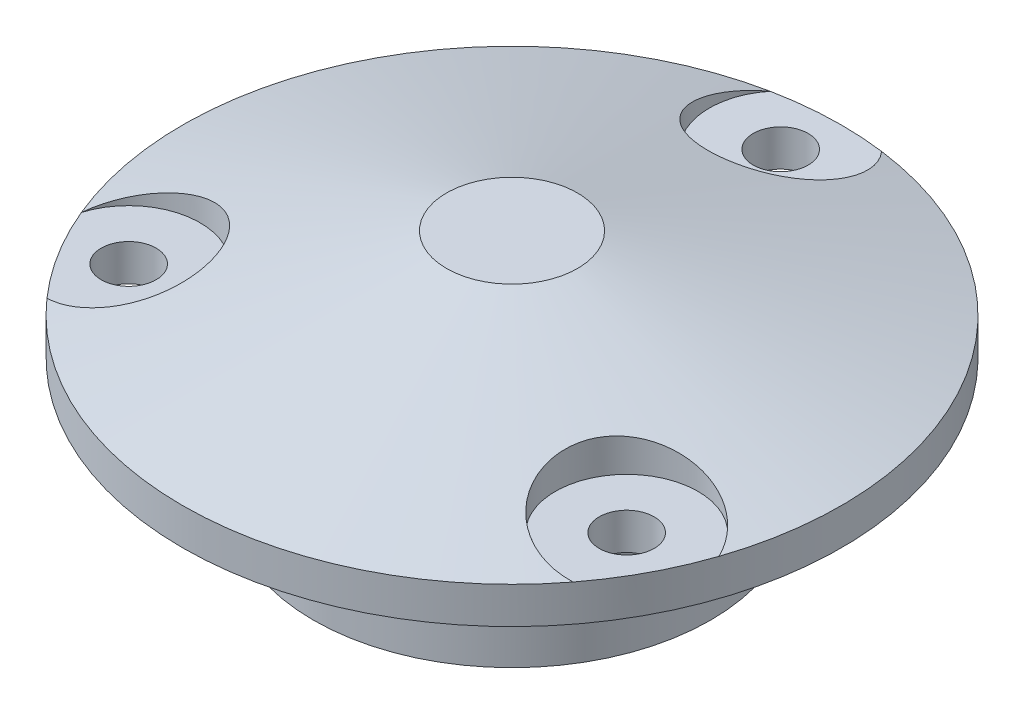
ISO-10303-21;
HEADER;
FILE_DESCRIPTION(('STEP AP214'),'2;1');
FILE_NAME('part.step','',(''),(''),'','','');
FILE_SCHEMA(('AUTOMOTIVE_DESIGN { 1 0 10303 214 1 1 1 1 }'));
ENDSEC;
DATA;
#1=APPLICATION_CONTEXT('core data for automotive mechanical design processes');
#2=APPLICATION_PROTOCOL_DEFINITION('international standard','automotive_design',2000,#1);
#3=PRODUCT_CONTEXT('',#1,'mechanical');
#4=PRODUCT('Part','Part','',(#3));
#5=PRODUCT_RELATED_PRODUCT_CATEGORY('part','',(#4));
#6=PRODUCT_DEFINITION_FORMATION('','',#4);
#7=PRODUCT_DEFINITION_CONTEXT('part definition',#1,'design');
#8=PRODUCT_DEFINITION('design','',#6,#7);
#9=PRODUCT_DEFINITION_SHAPE('','',#8);
#10=(LENGTH_UNIT() NAMED_UNIT(*) SI_UNIT(.MILLI.,.METRE.));
#11=(NAMED_UNIT(*) PLANE_ANGLE_UNIT() SI_UNIT($,.RADIAN.));
#12=(NAMED_UNIT(*) SI_UNIT($,.STERADIAN.) SOLID_ANGLE_UNIT());
#13=UNCERTAINTY_MEASURE_WITH_UNIT(LENGTH_MEASURE(1.E-05),#10,'distance_accuracy_value','');
#14=(GEOMETRIC_REPRESENTATION_CONTEXT(3) GLOBAL_UNCERTAINTY_ASSIGNED_CONTEXT((#13)) GLOBAL_UNIT_ASSIGNED_CONTEXT((#10,
#11,#12)) REPRESENTATION_CONTEXT('',''));
#15=CARTESIAN_POINT('',(0.,0.,0.));
#16=DIRECTION('',(0.,0.,1.));
#17=DIRECTION('',(1.,0.,0.));
#18=AXIS2_PLACEMENT_3D('',#15,#16,#17);
#19=CARTESIAN_POINT('',(-0.514611842093936,11.,-15.1912861421265));
#20=DIRECTION('',(0.,-1.,0.));
#21=DIRECTION('',(0.,0.,-1.));
#22=AXIS2_PLACEMENT_3D('',#19,#20,#21);
#23=CYLINDRICAL_SURFACE('',#22,1.50000000000036);
#24=CARTESIAN_POINT('',(-0.514611842093936,7.,-15.1912861421265));
#25=DIRECTION('',(0.,-1.,0.));
#26=DIRECTION('',(0.,0.,-1.));
#27=AXIS2_PLACEMENT_3D('',#24,#25,#26);
#28=CIRCLE('',#27,1.50000000000036);
#29=CARTESIAN_POINT('',(-0.514611842093936,7.,-16.6912861421269));
#30=VERTEX_POINT('',#29);
#31=EDGE_CURVE('E117',#30,#30,#28,.T.);
#32=ORIENTED_EDGE('',*,*,#31,.T.);
#33=EDGE_LOOP('',(#32));
#34=FACE_BOUND('',#33,.T.);
#35=CARTESIAN_POINT('',(-0.514611842093936,9.,-15.1912861421265));
#36=DIRECTION('',(0.,1.,0.));
#37=DIRECTION('',(0.,0.,1.));
#38=AXIS2_PLACEMENT_3D('',#35,#36,#37);
#39=CIRCLE('',#38,1.50000000000036);
#40=CARTESIAN_POINT('',(-0.514611842093936,9.,-13.6912861421262));
#41=VERTEX_POINT('',#40);
#42=EDGE_CURVE('E118',#41,#41,#39,.F.);
#43=ORIENTED_EDGE('',*,*,#42,.F.);
#44=EDGE_LOOP('',(#43));
#45=FACE_BOUND('',#44,.T.);
#46=ADVANCED_FACE('F33',(#34,#45),#23,.F.);
#47=CARTESIAN_POINT('',(13.4133456362877,11.,7.14997614272195));
#48=DIRECTION('',(0.,-1.,0.));
#49=DIRECTION('',(0.,0.,-1.));
#50=AXIS2_PLACEMENT_3D('',#47,#48,#49);
#51=CYLINDRICAL_SURFACE('',#50,1.50000000000077);
#52=CARTESIAN_POINT('',(13.4133456362877,7.,7.14997614272195));
#53=DIRECTION('',(0.,-1.,0.));
#54=DIRECTION('',(0.,0.,-1.));
#55=AXIS2_PLACEMENT_3D('',#52,#53,#54);
#56=CIRCLE('',#55,1.50000000000077);
#57=CARTESIAN_POINT('',(13.4133456362877,7.,5.64997614272117));
#58=VERTEX_POINT('',#57);
#59=EDGE_CURVE('E121',#58,#58,#56,.T.);
#60=ORIENTED_EDGE('',*,*,#59,.T.);
#61=EDGE_LOOP('',(#60));
#62=FACE_BOUND('',#61,.T.);
#63=CARTESIAN_POINT('',(13.4133456362877,9.,7.14997614272195));
#64=DIRECTION('',(0.,1.,0.));
#65=DIRECTION('',(0.,0.,1.));
#66=AXIS2_PLACEMENT_3D('',#63,#64,#65);
#67=CIRCLE('',#66,1.50000000000077);
#68=CARTESIAN_POINT('',(13.4133456362877,9.,8.64997614272272));
#69=VERTEX_POINT('',#68);
#70=EDGE_CURVE('E78',#69,#69,#67,.F.);
#71=ORIENTED_EDGE('',*,*,#70,.F.);
#72=EDGE_LOOP('',(#71));
#73=FACE_BOUND('',#72,.T.);
#74=ADVANCED_FACE('F147',(#62,#73),#51,.F.);
#75=CARTESIAN_POINT('',(-12.8987337941931,11.,8.04130999940566));
#76=DIRECTION('',(0.,-1.,0.));
#77=DIRECTION('',(0.,0.,-1.));
#78=AXIS2_PLACEMENT_3D('',#75,#76,#77);
#79=CYLINDRICAL_SURFACE('',#78,1.5);
#80=CARTESIAN_POINT('',(-12.8987337941931,7.,8.04130999940566));
#81=DIRECTION('',(0.,-1.,0.));
#82=DIRECTION('',(0.,0.,-1.));
#83=AXIS2_PLACEMENT_3D('',#80,#81,#82);
#84=CIRCLE('',#83,1.5);
#85=CARTESIAN_POINT('',(-12.8987337941931,7.,6.54130999940567));
#86=VERTEX_POINT('',#85);
#87=EDGE_CURVE('E126',#86,#86,#84,.T.);
#88=ORIENTED_EDGE('',*,*,#87,.T.);
#89=EDGE_LOOP('',(#88));
#90=FACE_BOUND('',#89,.T.);
#91=CARTESIAN_POINT('',(-12.8987337941931,9.,8.04130999940566));
#92=DIRECTION('',(0.,1.,0.));
#93=DIRECTION('',(0.,0.,1.));
#94=AXIS2_PLACEMENT_3D('',#91,#92,#93);
#95=CIRCLE('',#94,1.5);
#96=CARTESIAN_POINT('',(-12.8987337941931,9.,9.54130999940566));
#97=VERTEX_POINT('',#96);
#98=EDGE_CURVE('E79',#97,#97,#95,.F.);
#99=ORIENTED_EDGE('',*,*,#98,.F.);
#100=EDGE_LOOP('',(#99));
#101=FACE_BOUND('',#100,.T.);
#102=ADVANCED_FACE('F153',(#90,#101),#79,.F.);
#103=CARTESIAN_POINT('',(0.,0.,0.));
#104=DIRECTION('',(0.,1.,0.));
#105=DIRECTION('',(0.,0.,1.));
#106=AXIS2_PLACEMENT_3D('',#103,#104,#105);
#107=PLANE('',#106);
#108=CARTESIAN_POINT('',(0.,0.,0.));
#109=DIRECTION('',(0.,1.,0.));
#110=DIRECTION('',(0.,0.,1.));
#111=AXIS2_PLACEMENT_3D('',#108,#109,#110);
#112=CIRCLE('',#111,10.85);
#113=CARTESIAN_POINT('',(0.,0.,10.85));
#114=VERTEX_POINT('',#113);
#115=EDGE_CURVE('E293',#114,#114,#112,.T.);
#116=ORIENTED_EDGE('',*,*,#115,.F.);
#117=EDGE_LOOP('',(#116));
#118=FACE_BOUND('',#117,.T.);
#119=CARTESIAN_POINT('',(0.,0.,0.));
#120=DIRECTION('',(0.,1.,0.));
#121=DIRECTION('',(0.,0.,1.));
#122=AXIS2_PLACEMENT_3D('',#119,#120,#121);
#123=CIRCLE('',#122,9.);
#124=CARTESIAN_POINT('',(0.,0.,9.));
#125=VERTEX_POINT('',#124);
#126=EDGE_CURVE('E112',#125,#125,#123,.T.);
#127=ORIENTED_EDGE('',*,*,#126,.T.);
#128=EDGE_LOOP('',(#127));
#129=FACE_BOUND('',#128,.T.);
#130=ADVANCED_FACE('F160',(#118,#129),#107,.F.);
#131=CARTESIAN_POINT('',(0.,7.,0.));
#132=DIRECTION('',(0.,-1.,0.));
#133=DIRECTION('',(0.,0.,-1.));
#134=AXIS2_PLACEMENT_3D('',#131,#132,#133);
#135=CYLINDRICAL_SURFACE('',#134,10.85);
#136=CARTESIAN_POINT('',(0.,7.,0.));
#137=DIRECTION('',(0.,1.,0.));
#138=DIRECTION('',(0.,0.,1.));
#139=AXIS2_PLACEMENT_3D('',#136,#137,#138);
#140=CIRCLE('',#139,10.85);
#141=CARTESIAN_POINT('',(0.,7.,10.85));
#142=VERTEX_POINT('',#141);
#143=EDGE_CURVE('E95',#142,#142,#140,.T.);
#144=ORIENTED_EDGE('',*,*,#143,.F.);
#145=EDGE_LOOP('',(#144));
#146=FACE_BOUND('',#145,.T.);
#147=ORIENTED_EDGE('',*,*,#115,.T.);
#148=EDGE_LOOP('',(#147));
#149=FACE_BOUND('',#148,.T.);
#150=ADVANCED_FACE('F35',(#146,#149),#135,.T.);
#151=CARTESIAN_POINT('',(0.,7.,0.));
#152=DIRECTION('',(0.,-1.,0.));
#153=DIRECTION('',(0.,0.,-1.));
#154=AXIS2_PLACEMENT_3D('',#151,#152,#153);
#155=CYLINDRICAL_SURFACE('',#154,9.);
#156=CARTESIAN_POINT('',(0.,7.,0.));
#157=DIRECTION('',(0.,1.,0.));
#158=DIRECTION('',(0.,0.,1.));
#159=AXIS2_PLACEMENT_3D('',#156,#157,#158);
#160=CIRCLE('',#159,9.);
#161=CARTESIAN_POINT('',(0.,7.,9.));
#162=VERTEX_POINT('',#161);
#163=EDGE_CURVE('E108',#162,#162,#160,.T.);
#164=ORIENTED_EDGE('',*,*,#163,.T.);
#165=EDGE_LOOP('',(#164));
#166=FACE_BOUND('',#165,.T.);
#167=ORIENTED_EDGE('',*,*,#126,.F.);
#168=EDGE_LOOP('',(#167));
#169=FACE_BOUND('',#168,.T.);
#170=ADVANCED_FACE('F264',(#166,#169),#155,.F.);
#171=CARTESIAN_POINT('',(0.,7.,0.));
#172=DIRECTION('',(0.,1.,0.));
#173=DIRECTION('',(0.,0.,1.));
#174=AXIS2_PLACEMENT_3D('',#171,#172,#173);
#175=PLANE('',#174);
#176=ORIENTED_EDGE('',*,*,#163,.F.);
#177=EDGE_LOOP('',(#176));
#178=FACE_BOUND('',#177,.T.);
#179=ADVANCED_FACE('F144',(#178),#175,.F.);
#180=CARTESIAN_POINT('',(0.,9.,0.));
#181=DIRECTION('',(0.,-1.,0.));
#182=DIRECTION('',(0.,0.,-1.));
#183=AXIS2_PLACEMENT_3D('',#180,#181,#182);
#184=CYLINDRICAL_SURFACE('',#183,18.);
#185=CARTESIAN_POINT('',(0.,9.,0.));
#186=DIRECTION('',(0.,1.,0.));
#187=DIRECTION('',(0.,0.,1.));
#188=AXIS2_PLACEMENT_3D('',#185,#186,#187);
#189=CIRCLE('',#188,18.);
#190=CARTESIAN_POINT('',(14.285312354494,9.,10.9512488299071));
#191=VERTEX_POINT('',#190);
#192=CARTESIAN_POINT('',(17.0552623288384,9.,5.75482640003215));
#193=VERTEX_POINT('',#192);
#194=EDGE_CURVE('E100',#191,#193,#189,.T.);
#195=ORIENTED_EDGE('',*,*,#194,.F.);
#196=CARTESIAN_POINT('',(-13.5114570212166,9.,11.8928772449654));
#197=VERTEX_POINT('',#196);
#198=EDGE_CURVE('E92',#197,#191,#189,.T.);
#199=ORIENTED_EDGE('',*,*,#198,.F.);
#200=CARTESIAN_POINT('',(0.,9.,0.));
#201=DIRECTION('',(0.,1.,0.));
#202=DIRECTION('',(0.,0.,1.));
#203=AXIS2_PLACEMENT_3D('',#200,#201,#202);
#204=CIRCLE('',#203,18.);
#205=CARTESIAN_POINT('',(-16.626715867111,9.,6.89581898503428));
#206=VERTEX_POINT('',#205);
#207=EDGE_CURVE('E72',#206,#197,#204,.T.);
#208=ORIENTED_EDGE('',*,*,#207,.F.);
#209=CARTESIAN_POINT('',(-3.54380530761995,9.,-17.6477036449983));
#210=VERTEX_POINT('',#209);
#211=EDGE_CURVE('E94',#210,#206,#189,.T.);
#212=ORIENTED_EDGE('',*,*,#211,.F.);
#213=CARTESIAN_POINT('',(0.,9.,0.));
#214=DIRECTION('',(0.,1.,0.));
#215=DIRECTION('',(0.,0.,1.));
#216=AXIS2_PLACEMENT_3D('',#213,#214,#215);
#217=CIRCLE('',#216,18.);
#218=CARTESIAN_POINT('',(2.34140351261658,9.,-17.8470678149411));
#219=VERTEX_POINT('',#218);
#220=EDGE_CURVE('E116',#219,#210,#217,.T.);
#221=ORIENTED_EDGE('',*,*,#220,.F.);
#222=EDGE_CURVE('E103',#193,#219,#189,.T.);
#223=ORIENTED_EDGE('',*,*,#222,.F.);
#224=EDGE_LOOP('',(#195,#199,#208,#212,#221,#223));
#225=FACE_BOUND('',#224,.T.);
#226=CARTESIAN_POINT('',(0.,7.,0.));
#227=DIRECTION('',(0.,1.,0.));
#228=DIRECTION('',(0.,0.,1.));
#229=AXIS2_PLACEMENT_3D('',#226,#227,#228);
#230=CIRCLE('',#229,18.);
#231=CARTESIAN_POINT('',(0.,7.,18.));
#232=VERTEX_POINT('',#231);
#233=EDGE_CURVE('E101',#232,#232,#230,.T.);
#234=ORIENTED_EDGE('',*,*,#233,.T.);
#235=EDGE_LOOP('',(#234));
#236=FACE_BOUND('',#235,.T.);
#237=ADVANCED_FACE('F97',(#225,#236),#184,.T.);
#238=ORIENTED_EDGE('',*,*,#87,.F.);
#239=EDGE_LOOP('',(#238));
#240=FACE_BOUND('',#239,.T.);
#241=ORIENTED_EDGE('',*,*,#59,.F.);
#242=EDGE_LOOP('',(#241));
#243=FACE_BOUND('',#242,.T.);
#244=ORIENTED_EDGE('',*,*,#31,.F.);
#245=EDGE_LOOP('',(#244));
#246=FACE_BOUND('',#245,.T.);
#247=ORIENTED_EDGE('',*,*,#143,.T.);
#248=EDGE_LOOP('',(#247));
#249=FACE_BOUND('',#248,.T.);
#250=ORIENTED_EDGE('',*,*,#233,.F.);
#251=EDGE_LOOP('',(#250));
#252=FACE_BOUND('',#251,.T.);
#253=ADVANCED_FACE('F136',(#240,#243,#246,#249,#252),#175,.F.);
#254=CARTESIAN_POINT('',(0.,9.,0.));
#255=DIRECTION('',(0.,-1.,0.));
#256=DIRECTION('',(0.,0.,1.));
#257=AXIS2_PLACEMENT_3D('',#254,#255,#256);
#258=CONICAL_SURFACE('',#257,18.,1.30027029273578);
#259=CARTESIAN_POINT('',(0.,13.,0.));
#260=DIRECTION('',(0.,1.,0.));
#261=DIRECTION('',(0.,0.,1.));
#262=AXIS2_PLACEMENT_3D('',#259,#260,#261);
#263=CIRCLE('',#262,3.57646596495634);
#264=CARTESIAN_POINT('',(0.,13.,3.57646596495634));
#265=VERTEX_POINT('',#264);
#266=EDGE_CURVE('E105',#265,#265,#263,.T.);
#267=ORIENTED_EDGE('',*,*,#266,.F.);
#268=EDGE_LOOP('',(#267));
#269=FACE_BOUND('',#268,.T.);
#270=ORIENTED_EDGE('',*,*,#222,.T.);
#271=CARTESIAN_POINT('',(2.34063294063594,8.9998,-17.8478962434952));
#272=CARTESIAN_POINT('',(2.41697476906014,9.01960432029536,-17.7658628833271));
#273=CARTESIAN_POINT('',(2.48965575463602,9.04024400706451,-17.6806409991363));
#274=CARTESIAN_POINT('',(2.62725546708487,9.08308142590544,-17.5045374242219));
#275=CARTESIAN_POINT('',(2.69217566167115,9.10527886211294,-17.4136568086323));
#276=CARTESIAN_POINT('',(2.81374004086759,9.15108808098175,-17.2270786040962));
#277=CARTESIAN_POINT('',(2.87039797547931,9.17469741943295,-17.1313893829437));
#278=CARTESIAN_POINT('',(2.97522064539394,9.22323634310521,-16.9358190137901));
#279=CARTESIAN_POINT('',(3.02338516399314,9.24816596199123,-16.8359377589126));
#280=CARTESIAN_POINT('',(3.15466441875566,9.32474339099612,-16.5311477500894));
#281=CARTESIAN_POINT('',(3.22470008334957,9.37823072470449,-16.3208841567296));
#282=CARTESIAN_POINT('',(3.32814786567089,9.48890662177049,-15.8925867533273));
#283=CARTESIAN_POINT('',(3.36155375871864,9.54609581245498,-15.6745516291278));
#284=CARTESIAN_POINT('',(3.39158566074824,9.66414723598745,-15.2322743948386));
#285=CARTESIAN_POINT('',(3.38747147947888,9.72505973213838,-15.0079947919914));
#286=CARTESIAN_POINT('',(3.34104471109292,9.84805167470234,-14.5637309926598));
#287=CARTESIAN_POINT('',(3.2987248321539,9.91013134166326,-14.34374762433));
#288=CARTESIAN_POINT('',(3.17605514299334,10.034856850505,-13.9104583683503));
#289=CARTESIAN_POINT('',(3.0950738447657,10.0974944937482,-13.6973284948538));
#290=CARTESIAN_POINT('',(2.89691587880258,10.2202765492199,-13.2878091273023));
#291=CARTESIAN_POINT('',(2.77973851796399,10.2804209136806,-13.0914199538999));
#292=CARTESIAN_POINT('',(2.51256180464274,10.3956982364815,-12.7218706625308));
#293=CARTESIAN_POINT('',(2.36268550710104,10.450848914924,-12.5486272795421));
#294=CARTESIAN_POINT('',(2.03358311923908,10.553791385868,-12.2300148484713));
#295=CARTESIAN_POINT('',(1.85436105413633,10.6015841858722,-12.0846419834531));
#296=CARTESIAN_POINT('',(1.47790999672663,10.6855538346794,-11.831290895437));
#297=CARTESIAN_POINT('',(1.28150172065491,10.7220707373655,-11.7222081218028));
#298=CARTESIAN_POINT('',(0.871316728822382,10.7831554985811,-11.5389452090264));
#299=CARTESIAN_POINT('',(0.657547876043658,10.8077287318194,-11.4647493710857));
#300=CARTESIAN_POINT('',(0.231612252084536,10.8420112878336,-11.3574021998377));
#301=CARTESIAN_POINT('',(0.0200259473185642,10.8524758215883,-11.3221853398477));
#302=CARTESIAN_POINT('',(-0.406274524458361,10.8602293658847,-11.2869332057943));
#303=CARTESIAN_POINT('',(-0.620987897200793,10.8575216659012,-11.286889148553));
#304=CARTESIAN_POINT('',(-1.03911117693649,10.8394945190928,-11.3212342471588));
#305=CARTESIAN_POINT('',(-1.24264698321864,10.8246408284035,-11.3543617575371));
#306=CARTESIAN_POINT('',(-1.64093359985215,10.7839675355721,-11.4518419709362));
#307=CARTESIAN_POINT('',(-1.83568376351764,10.7581471276538,-11.5161969684371));
#308=CARTESIAN_POINT('',(-2.21470569454323,10.696631483714,-11.6752300699824));
#309=CARTESIAN_POINT('',(-2.39873939421595,10.6607739219942,-11.7704110597852));
#310=CARTESIAN_POINT('',(-2.74830417935775,10.5813579813276,-11.9876945010701));
#311=CARTESIAN_POINT('',(-2.91383111916674,10.5377978825708,-12.1098029663828));
#312=CARTESIAN_POINT('',(-3.23091594571764,10.4425239148044,-12.3845153755062));
#313=CARTESIAN_POINT('',(-3.38128734275724,10.3905023921978,-12.5383820098028));
#314=CARTESIAN_POINT('',(-3.65421751230065,10.2822635976626,-12.8677873060413));
#315=CARTESIAN_POINT('',(-3.7767697519062,10.2260453443071,-13.0433310436026));
#316=CARTESIAN_POINT('',(-3.99640486159216,10.1086150917399,-13.4201561991823));
#317=CARTESIAN_POINT('',(-4.09201659635385,10.0472925994391,-13.6222603486567));
#318=CARTESIAN_POINT('',(-4.24737930959957,9.92400013418865,-14.0397638152771));
#319=CARTESIAN_POINT('',(-4.3071261259787,9.86203008693925,-14.2551646723014));
#320=CARTESIAN_POINT('',(-4.36900328170626,9.76928012711049,-14.5857790306156));
#321=CARTESIAN_POINT('',(-4.38502111477975,9.73807523293325,-14.698444779502));
#322=CARTESIAN_POINT('',(-4.40716029285597,9.67613351724899,-14.9248598324));
#323=CARTESIAN_POINT('',(-4.41328522772552,9.64539652996359,-15.0386087282879));
#324=CARTESIAN_POINT('',(-4.41555323077004,9.58455827598238,-15.266443334901));
#325=CARTESIAN_POINT('',(-4.41169019687377,9.55445740924484,-15.3805292089723));
#326=CARTESIAN_POINT('',(-4.39395301113351,9.49509555250673,-15.6080953777851));
#327=CARTESIAN_POINT('',(-4.38008280464813,9.46583423623662,-15.7215758934341));
#328=CARTESIAN_POINT('',(-4.3424700828426,9.4084490920051,-15.9465647813218));
#329=CARTESIAN_POINT('',(-4.31877696083772,9.38032033474814,-16.0580801508053));
#330=CARTESIAN_POINT('',(-4.26164343737885,9.32521278986416,-16.2788278744317));
#331=CARTESIAN_POINT('',(-4.228206931597,9.29823354756156,-16.3880611223588));
#332=CARTESIAN_POINT('',(-4.15179624176639,9.24558297572278,-16.6033501588951));
#333=CARTESIAN_POINT('',(-4.10883056706492,9.21991050425904,-16.7094086871565));
#334=CARTESIAN_POINT('',(-4.01361590906407,9.16999506658859,-16.9175726997846));
#335=CARTESIAN_POINT('',(-3.96137076655515,9.14575151445745,-17.0196797984423));
#336=CARTESIAN_POINT('',(-3.85186780811516,9.10044926732064,-17.2122049650379));
#337=CARTESIAN_POINT('',(-3.79521275412486,9.07928635830424,-17.3029418024423));
#338=CARTESIAN_POINT('',(-3.67457297273125,9.03842934736777,-17.4795350873305));
#339=CARTESIAN_POINT('',(-3.61059992887184,9.01873298480379,-17.5653989955904));
#340=CARTESIAN_POINT('',(-3.54309256461351,8.9998,-17.6485823215333));
#341=B_SPLINE_CURVE_WITH_KNOTS('',3,(#271,#272,#273,#274,#275,#276,#277,#278,#279,#280,#281,
#282,#283,#284,#285,#286,#287,#288,#289,#290,#291,#292,#293,#294,#295,#296,#297,#298,#299,#300,
#301,#302,#303,#304,#305,#306,#307,#308,#309,#310,#311,#312,#313,#314,#315,#316,#317,#318,#319,
#320,#321,#322,#323,#324,#325,#326,#327,#328,#329,#330,#331,#332,#333,#334,#335,#336,#337,#338,
#339,#340),.UNSPECIFIED.,.F.,.F.,(4,2,2,2,2,2,2,2,2,2,2,2,2,2,2,2,2,2,2,2,2,2,2,2,2,2,2,2,2,2,2,
2,2,2,4),(0.,0.341266377634936,0.682468112854666,1.02309537847207,1.36373133370481,
2.04425145497665,2.7248872025109,3.41897903218749,4.11320336211696,4.81917656978562,
5.52516329667515,6.22853767540048,6.93181565634804,7.61115191406356,8.29018218349536,
8.93119272001046,9.5720431865023,10.189411557571,10.8068252974483,11.4348666173332,
12.0630483427379,12.7241470728139,13.3854008914482,14.0777936352517,14.7702667153425,
15.1239168543391,15.4774386343529,15.8311764467559,16.1847748730929,16.5366164333203,
16.8883175102086,17.2397057809756,17.5909489489226,17.9177228392273,18.2439821142607),.UNSPECIFIED.);
#342=EDGE_CURVE('E11',#219,#210,#341,.T.);
#343=ORIENTED_EDGE('',*,*,#342,.T.);
#344=ORIENTED_EDGE('',*,*,#211,.T.);
#345=CARTESIAN_POINT('',(-16.6199903611225,8.72253024542837,9.20846447208093));
#346=CARTESIAN_POINT('',(-16.6849572072063,8.73461393803117,9.0012942763353));
#347=CARTESIAN_POINT('',(-16.7325629004093,8.75063723482571,8.78873344693336));
#348=CARTESIAN_POINT('',(-16.7918168503906,8.79025954170759,8.35916992832107));
#349=CARTESIAN_POINT('',(-16.8034179653901,8.8138684392616,8.14216178980491));
#350=CARTESIAN_POINT('',(-16.7906554869817,8.86817034411797,7.71037751002507));
#351=CARTESIAN_POINT('',(-16.7663374817194,8.89885433010491,7.49559888733374));
#352=CARTESIAN_POINT('',(-16.6829851983711,8.96673325275024,7.07403940287521));
#353=CARTESIAN_POINT('',(-16.623958652621,9.00392673793272,6.86725677070052));
#354=CARTESIAN_POINT('',(-16.4721784622772,9.08475091198276,6.4641028765394));
#355=CARTESIAN_POINT('',(-16.3789265018329,9.1284707370651,6.26793727727744));
#356=CARTESIAN_POINT('',(-16.1619192179596,9.2210900469227,5.89462514764674));
#357=CARTESIAN_POINT('',(-16.0381590704853,9.2699903501526,5.71748163147202));
#358=CARTESIAN_POINT('',(-15.7602663671424,9.37339058254685,5.38231419188643));
#359=CARTESIAN_POINT('',(-15.6054176245048,9.42800433761416,5.2249192177541));
#360=CARTESIAN_POINT('',(-15.2721740643145,9.5405896002576,4.93888847372229));
#361=CARTESIAN_POINT('',(-15.0937759918913,9.59856157136689,4.81025668595951));
#362=CARTESIAN_POINT('',(-14.713717631494,9.71810706115133,4.5820926624996));
#363=CARTESIAN_POINT('',(-14.5115837382244,9.77973455693106,4.48337713705021));
#364=CARTESIAN_POINT('',(-14.0935649213597,9.90369068609932,4.32209183914499));
#365=CARTESIAN_POINT('',(-13.8776784129337,9.96601939961121,4.2595262409488));
#366=CARTESIAN_POINT('',(-13.4348706163045,10.0905463229965,4.17165345313193));
#367=CARTESIAN_POINT('',(-13.2078344190306,10.1527294156641,4.14690208546345));
#368=CARTESIAN_POINT('',(-12.752052696888,10.2739465890168,4.13740912890698));
#369=CARTESIAN_POINT('',(-12.5233070949654,10.3329805267611,4.15266935458021));
#370=CARTESIAN_POINT('',(-12.0724279105314,10.4450483711144,4.22308085183788));
#371=CARTESIAN_POINT('',(-11.8502567111821,10.4981254195939,4.27792057211017));
#372=CARTESIAN_POINT('',(-11.4173304400263,10.596148146201,4.42637272023379));
#373=CARTESIAN_POINT('',(-11.2065730275685,10.641095495962,4.51997716420847));
#374=CARTESIAN_POINT('',(-10.8111021512625,10.7185438559452,4.7396487477556));
#375=CARTESIAN_POINT('',(-10.6256972530279,10.7514584703511,4.86432271818987));
#376=CARTESIAN_POINT('',(-10.2779005756585,10.8048822946443,5.14458022877665));
#377=CARTESIAN_POINT('',(-10.1154984226366,10.8253971103782,5.3001497589756));
#378=CARTESIAN_POINT('',(-9.8277286381538,10.8516205576814,5.62805221267301));
#379=CARTESIAN_POINT('',(-9.70078987005799,10.8580983235842,5.79894668097657));
#380=CARTESIAN_POINT('',(-9.47641904607519,10.85805044973,6.15909150615164));
#381=CARTESIAN_POINT('',(-9.37898127513497,10.8515273304164,6.34833829834534));
#382=CARTESIAN_POINT('',(-9.21878401851783,10.8263734068766,6.73356097196261));
#383=CARTESIAN_POINT('',(-9.15508053270016,10.8081079565798,6.92917006427503));
#384=CARTESIAN_POINT('',(-9.05930455113956,10.7610710982645,7.32674258740963));
#385=CARTESIAN_POINT('',(-9.02723541251181,10.7322985756534,7.52870669029493));
#386=CARTESIAN_POINT('',(-8.99452790857846,10.6651426955486,7.93873136852351));
#387=CARTESIAN_POINT('',(-8.99468984256044,10.6265384149353,8.14681879046513));
#388=CARTESIAN_POINT('',(-9.02770442979412,10.5421391013561,8.55888622861999));
#389=CARTESIAN_POINT('',(-9.06056464460903,10.4963424071889,8.76286528363086));
#390=CARTESIAN_POINT('',(-9.16018860071162,10.3969306778564,9.17273103863807));
#391=CARTESIAN_POINT('',(-9.22868640488742,10.343027081315,9.37812654969105));
#392=CARTESIAN_POINT('',(-9.39813615345353,10.2315621947382,9.77399664423825));
#393=CARTESIAN_POINT('',(-9.4990955484906,10.1740000674257,9.9644677897691));
#394=CARTESIAN_POINT('',(-9.7357171065602,10.0545194531017,10.3337953464857));
#395=CARTESIAN_POINT('',(-9.87270595411763,9.99252059732611,10.5117772003322));
#396=CARTESIAN_POINT('',(-10.1751105895012,9.86842118948752,10.8416598951542));
#397=CARTESIAN_POINT('',(-10.3405297015651,9.80632062637422,10.9935576820667));
#398=CARTESIAN_POINT('',(-10.6981741220705,9.68263684390138,11.2692063305586));
#399=CARTESIAN_POINT('',(-10.8907882285764,9.62107806218335,11.3924645046399));
#400=CARTESIAN_POINT('',(-11.2953300291459,9.50100815852561,11.603776543397));
#401=CARTESIAN_POINT('',(-11.5072574238663,9.44249698937198,11.6918309535942));
#402=CARTESIAN_POINT('',(-11.9423569780244,9.33035451745866,11.8290408380988));
#403=CARTESIAN_POINT('',(-12.1654102672525,9.27668390807155,11.8785405116249));
#404=CARTESIAN_POINT('',(-12.6179593714381,9.17478950764235,11.9378757964227));
#405=CARTESIAN_POINT('',(-12.84745443199,9.12656508208475,11.9477160329177));
#406=CARTESIAN_POINT('',(-13.300433395257,9.03765382716315,11.9270304337307));
#407=CARTESIAN_POINT('',(-13.5239308206276,8.99681540435669,11.8974560475998));
#408=CARTESIAN_POINT('',(-13.963583563744,8.92213925289765,11.7998695815644));
#409=CARTESIAN_POINT('',(-14.1797402998331,8.88830016535023,11.7318649723307));
#410=CARTESIAN_POINT('',(-14.5921486487729,8.82914495401614,11.5613621859375));
#411=CARTESIAN_POINT('',(-14.7887845035772,8.80361977371525,11.4598655364114));
#412=CARTESIAN_POINT('',(-15.1627106082369,8.76034931710317,11.2245765843366));
#413=CARTESIAN_POINT('',(-15.3399985988788,8.74260494861406,11.0907805160928));
#414=CARTESIAN_POINT('',(-15.6660261616751,8.71556102024926,10.7979530008234));
#415=CARTESIAN_POINT('',(-15.8153053834797,8.70608522554291,10.639537583379));
#416=CARTESIAN_POINT('',(-16.0854224246347,8.69512082863377,10.3000583198023));
#417=CARTESIAN_POINT('',(-16.2062974891408,8.6936217104623,10.1190246148679));
#418=CARTESIAN_POINT('',(-16.3746733637426,8.69761603217426,9.81474481501479));
#419=CARTESIAN_POINT('',(-16.4322920344438,8.70057988545976,9.69693933615355));
#420=CARTESIAN_POINT('',(-16.535372644569,8.7093955757697,9.45623007303881));
#421=CARTESIAN_POINT('',(-16.5808347187269,8.71524738078439,9.33332634530758));
#422=CARTESIAN_POINT('',(-16.6199903611225,8.72253024542837,9.20846447208093));
#423=B_SPLINE_CURVE_WITH_KNOTS('',3,(#345,#346,#347,#348,#349,#350,#351,#352,#353,#354,#355,
#356,#357,#358,#359,#360,#361,#362,#363,#364,#365,#366,#367,#368,#369,#370,#371,#372,#373,#374,
#375,#376,#377,#378,#379,#380,#381,#382,#383,#384,#385,#386,#387,#388,#389,#390,#391,#392,#393,
#394,#395,#396,#397,#398,#399,#400,#401,#402,#403,#404,#405,#406,#407,#408,#409,#410,#411,#412,
#413,#414,#415,#416,#417,#418,#419,#420,#421,#422),.UNSPECIFIED.,.T.,.F.,(4,2,2,2,2,2,2,2,2,2,2,
2,2,2,2,2,2,2,2,2,2,2,2,2,2,2,2,2,2,2,2,2,2,2,2,2,2,2,4),(0.,0.65187295286065,1.3045990614964,
1.95649744898376,2.60825066215449,3.26989626700585,3.93164656041468,4.61088402713371,
5.29021547315129,5.98669881205011,6.68326255834635,7.38996962770283,8.09670874740528,
8.7979445882492,9.49903607624263,10.1730540888052,10.8467671550275,11.4825193471895,
12.1181482999294,12.7348989858281,13.3517151157964,13.9838486886288,14.6161284779885,
15.2825324807556,15.9490895471671,16.644851810679,17.3406954823216,18.047745366284,
18.7547842932994,19.4554363493427,20.1560066905096,20.8399682329888,21.5237968619876,
22.1887929119185,22.8538665292788,23.5043920428786,24.1540597300479,24.5469491602093,
24.9398342357243),.UNSPECIFIED.);
#424=EDGE_CURVE('E84',#206,#197,#423,.T.);
#425=ORIENTED_EDGE('',*,*,#424,.T.);
#426=ORIENTED_EDGE('',*,*,#198,.T.);
#427=CARTESIAN_POINT('',(17.1287810648287,8.70900057454306,8.33553068653047));
#428=CARTESIAN_POINT('',(17.0636768924127,8.70047964836347,8.53952075430723));
#429=CARTESIAN_POINT('',(16.9816361831853,8.69581127398873,8.73843986726277));
#430=CARTESIAN_POINT('',(16.7858962916909,8.69429395159522,9.12026551475699));
#431=CARTESIAN_POINT('',(16.672160373301,8.69745411092183,9.30315314280623));
#432=CARTESIAN_POINT('',(16.4151951355982,8.71160882811813,9.64911969621208));
#433=CARTESIAN_POINT('',(16.2717114069617,8.72267312436477,9.81200705885339));
#434=CARTESIAN_POINT('',(15.9602214804407,8.75249561526081,10.1114106245486));
#435=CARTESIAN_POINT('',(15.7922201829796,8.77125227376033,10.2479320848203));
#436=CARTESIAN_POINT('',(15.4367726542306,8.81608571637826,10.4909440973811));
#437=CARTESIAN_POINT('',(15.2493370109241,8.84215852767507,10.5974508855172));
#438=CARTESIAN_POINT('',(14.8604123911837,8.90113674392311,10.7779186540179));
#439=CARTESIAN_POINT('',(14.6589224456442,8.93404262035395,10.8518773874765));
#440=CARTESIAN_POINT('',(14.2449803381677,9.0065372295708,10.96639916035));
#441=CARTESIAN_POINT('',(14.032421059639,9.04620592295435,11.006523757142));
#442=CARTESIAN_POINT('',(13.604720000692,9.13118148247853,11.0512098570522));
#443=CARTESIAN_POINT('',(13.3895779518855,9.17648893923379,11.0557676316445));
#444=CARTESIAN_POINT('',(12.9571363728222,9.27310037436341,11.0294046775839));
#445=CARTESIAN_POINT('',(12.7399188600459,9.32452659127814,10.9975879745488));
#446=CARTESIAN_POINT('',(12.3147896627527,9.4313994741941,10.8984209944435));
#447=CARTESIAN_POINT('',(12.1068792600227,9.48684669123435,10.831065839206));
#448=CARTESIAN_POINT('',(11.7005080904843,9.60214064431306,10.6608150265411));
#449=CARTESIAN_POINT('',(11.5024443821702,9.66206507526555,10.5570238497446));
#450=CARTESIAN_POINT('',(11.1272359134848,9.78358656730087,10.3175081837937));
#451=CARTESIAN_POINT('',(10.9500938632615,9.84518384381231,10.1817795643285));
#452=CARTESIAN_POINT('',(10.6183292006572,9.96968442006816,9.87930398765021));
#453=CARTESIAN_POINT('',(10.464204638262,10.032590074677,9.71201118323877));
#454=CARTESIAN_POINT('',(10.1870391791678,10.1566417753152,9.35279668553635));
#455=CARTESIAN_POINT('',(10.0640007062849,10.2177876838059,9.16087307351282));
#456=CARTESIAN_POINT('',(9.85272491403435,10.3361798090967,8.75741787889048));
#457=CARTESIAN_POINT('',(9.76451296845778,10.3934231575544,8.54587213813518));
#458=CARTESIAN_POINT('',(9.62618416428102,10.5014505268395,8.10907296190674));
#459=CARTESIAN_POINT('',(9.57606354959181,10.5522351841305,7.88382088034734));
#460=CARTESIAN_POINT('',(9.51714735136349,10.6432529158235,7.43265715118501));
#461=CARTESIAN_POINT('',(9.50721348049613,10.6837457061599,7.20694769563675));
#462=CARTESIAN_POINT('',(9.52678362438851,10.7534181491019,6.7554876953134));
#463=CARTESIAN_POINT('',(9.55627113751055,10.7826025287696,6.52973720725736));
#464=CARTESIAN_POINT('',(9.65185099607763,10.826222138408,6.09762571333332));
#465=CARTESIAN_POINT('',(9.71586781513525,10.8413724708793,5.89087760287718));
#466=CARTESIAN_POINT('',(9.87747870966167,10.8584008970085,5.49038939921036));
#467=CARTESIAN_POINT('',(9.97506215617417,10.8602831879746,5.29664521145689));
#468=CARTESIAN_POINT('',(10.1958330910263,10.8508469848902,4.93630996682341));
#469=CARTESIAN_POINT('',(10.3177185011496,10.8401005585324,4.76890326129705));
#470=CARTESIAN_POINT('',(10.5857272328339,10.8071290738651,4.45609461153837));
#471=CARTESIAN_POINT('',(10.7318513618694,10.7849036330983,4.31069340069307));
#472=CARTESIAN_POINT('',(11.0452037149775,10.7302305950641,4.04441431476858));
#473=CARTESIAN_POINT('',(11.2125858237568,10.6977055803742,3.92373395675209));
#474=CARTESIAN_POINT('',(11.5628806664728,10.6243663001931,3.71081678246089));
#475=CARTESIAN_POINT('',(11.7457965646394,10.5835503434703,3.61858577912364));
#476=CARTESIAN_POINT('',(12.1317564578231,10.4934201103209,3.46037740448562));
#477=CARTESIAN_POINT('',(12.3353482466068,10.4437859541385,3.39591941557272));
#478=CARTESIAN_POINT('',(12.7491283471434,10.3397013848055,3.30109343662295));
#479=CARTESIAN_POINT('',(12.9593182561372,10.2852497995831,3.27073376738682));
#480=CARTESIAN_POINT('',(13.3917032181703,10.170645398179,3.24372882763825));
#481=CARTESIAN_POINT('',(13.6139704884521,10.110343581368,3.24885556869244));
#482=CARTESIAN_POINT('',(14.0541137829312,9.98851007601492,3.29661041373008));
#483=CARTESIAN_POINT('',(14.2719890857941,9.92697818869914,3.33924462740891));
#484=CARTESIAN_POINT('',(14.7029234021378,9.80282895154044,3.46236262346598));
#485=CARTESIAN_POINT('',(14.9157183062791,9.74022388463064,3.54378299674678));
#486=CARTESIAN_POINT('',(15.3245065651091,9.61708356831217,3.74276866088971));
#487=CARTESIAN_POINT('',(15.5204994935266,9.55654837144013,3.86033486843563));
#488=CARTESIAN_POINT('',(15.7970474911683,9.46849445459388,4.06112859169518));
#489=CARTESIAN_POINT('',(15.8862926612474,9.43961174669679,4.13210230197515));
#490=CARTESIAN_POINT('',(16.058402106982,9.38288471261886,4.28176127908551));
#491=CARTESIAN_POINT('',(16.1412688764754,9.35503998282619,4.3604435043984));
#492=CARTESIAN_POINT('',(16.2999787728826,9.30053296521534,4.5250137263599));
#493=CARTESIAN_POINT('',(16.3758198090946,9.27387103059284,4.61090385352056));
#494=CARTESIAN_POINT('',(16.5197974273232,9.2218905552432,4.78923847133402));
#495=CARTESIAN_POINT('',(16.5879371676179,9.19657146609663,4.88168024968281));
#496=CARTESIAN_POINT('',(16.7146775329329,9.14789324246002,5.07058058285877));
#497=CARTESIAN_POINT('',(16.7734413806454,9.12450507876558,5.16692216898456));
#498=CARTESIAN_POINT('',(16.8825067019993,9.07926926075763,5.36457533698941));
#499=CARTESIAN_POINT('',(16.9328116605017,9.05742097421684,5.46588484987314));
#500=CARTESIAN_POINT('',(17.0245608700998,9.01535598788858,5.67283590333547));
#501=CARTESIAN_POINT('',(17.0660002478217,8.99514018925447,5.77847978867227));
#502=CARTESIAN_POINT('',(17.139576798565,8.95646652068361,5.99322315389533));
#503=CARTESIAN_POINT('',(17.1717178237668,8.93800792489436,6.10232118193502));
#504=CARTESIAN_POINT('',(17.2256734534133,8.90340058784045,6.32026313525056));
#505=CARTESIAN_POINT('',(17.247738874639,8.88720363850172,6.4290373482195));
#506=CARTESIAN_POINT('',(17.2825333635641,8.85664570975093,6.64827831581185));
#507=CARTESIAN_POINT('',(17.2952662555026,8.84228398030542,6.75874435819995));
#508=CARTESIAN_POINT('',(17.3112438612487,8.81547518890576,6.98047735963614));
#509=CARTESIAN_POINT('',(17.3144984416956,8.80302614870003,7.09174336486652));
#510=CARTESIAN_POINT('',(17.3114712008321,8.78009196308106,7.31430748768149));
#511=CARTESIAN_POINT('',(17.305192172106,8.76960624358258,7.42560558631837));
#512=CARTESIAN_POINT('',(17.2806575784366,8.7485586683727,7.67187767374373));
#513=CARTESIAN_POINT('',(17.2600697731201,8.73848821565592,7.80666993850595));
#514=CARTESIAN_POINT('',(17.2048737513441,8.72142398530725,8.07350465266681));
#515=CARTESIAN_POINT('',(17.1702657832652,8.71443015317467,8.20554715073662));
#516=CARTESIAN_POINT('',(17.1287810648287,8.70900057454306,8.33553068653047));
#517=B_SPLINE_CURVE_WITH_KNOTS('',3,(#427,#428,#429,#430,#431,#432,#433,#434,#435,#436,#437,
#438,#439,#440,#441,#442,#443,#444,#445,#446,#447,#448,#449,#450,#451,#452,#453,#454,#455,#456,
#457,#458,#459,#460,#461,#462,#463,#464,#465,#466,#467,#468,#469,#470,#471,#472,#473,#474,#475,
#476,#477,#478,#479,#480,#481,#482,#483,#484,#485,#486,#487,#488,#489,#490,#491,#492,#493,#494,
#495,#496,#497,#498,#499,#500,#501,#502,#503,#504,#505,#506,#507,#508,#509,#510,#511,#512,#513,
#514,#515,#516),.UNSPECIFIED.,.T.,.F.,(4,2,2,2,2,2,2,2,2,2,2,2,2,2,2,2,2,2,2,2,2,2,2,2,2,2,2,2,
2,2,2,2,2,2,2,2,2,2,2,2,2,2,2,2,4),(0.,0.642410788783102,1.28556927874319,1.93447358894379,
2.58324837725715,3.23167154700328,3.88013947264574,4.53688684403995,5.19370306236607,
5.86705305507515,6.54049549887643,7.23180515354289,7.92320426103427,8.62788707627936,
9.33262481946409,10.0378750746723,10.7430557779248,11.4281162015513,12.1128899513255,
12.7604643105354,13.4078338021878,14.0269734340844,14.6461336957846,15.2700630308943,
15.8941197665532,16.5489585958391,17.203957186674,17.8918908876697,18.5799366688312,
19.2855112205671,19.9911036676462,20.3436321384218,20.6960220694131,21.0485165292043,
21.4008659035017,21.746183989506,22.0913594622732,22.4367241918382,22.7819456359466,
23.1180292131986,23.4539749946224,23.7895709412966,24.1250686041864,24.534423363279,
24.9437708705779),.UNSPECIFIED.);
#518=EDGE_CURVE('E47',#191,#193,#517,.T.);
#519=ORIENTED_EDGE('',*,*,#518,.T.);
#520=EDGE_LOOP('',(#270,#343,#344,#425,#426,#519));
#521=FACE_BOUND('',#520,.T.);
#522=ADVANCED_FACE('F90',(#269,#521),#258,.T.);
#523=CARTESIAN_POINT('',(0.,13.,0.));
#524=DIRECTION('',(0.,1.,0.));
#525=DIRECTION('',(0.,0.,1.));
#526=AXIS2_PLACEMENT_3D('',#523,#524,#525);
#527=PLANE('',#526);
#528=ORIENTED_EDGE('',*,*,#266,.T.);
#529=EDGE_LOOP('',(#528));
#530=FACE_BOUND('',#529,.T.);
#531=ADVANCED_FACE('F133',(#530),#527,.T.);
#532=CARTESIAN_POINT('',(-12.8987337941925,9.,8.04130999940528));
#533=DIRECTION('',(0.,1.,0.));
#534=DIRECTION('',(0.,0.,1.));
#535=AXIS2_PLACEMENT_3D('',#532,#533,#534);
#536=CYLINDRICAL_SURFACE('',#535,3.90000000000087);
#537=CARTESIAN_POINT('',(-12.8987337941925,9.,8.04130999940528));
#538=DIRECTION('',(0.,1.,0.));
#539=DIRECTION('',(0.,0.,1.));
#540=AXIS2_PLACEMENT_3D('',#537,#538,#539);
#541=CIRCLE('',#540,3.90000000000087);
#542=EDGE_CURVE('E53',#197,#206,#541,.T.);
#543=ORIENTED_EDGE('',*,*,#542,.F.);
#544=ORIENTED_EDGE('',*,*,#424,.F.);
#545=EDGE_LOOP('',(#543,#544));
#546=FACE_BOUND('',#545,.T.);
#547=ADVANCED_FACE('F83',(#546),#536,.F.);
#548=CARTESIAN_POINT('',(-12.8987337941925,9.,8.04130999940528));
#549=DIRECTION('',(0.,1.,0.));
#550=DIRECTION('',(0.,0.,1.));
#551=AXIS2_PLACEMENT_3D('',#548,#549,#550);
#552=PLANE('',#551);
#553=ORIENTED_EDGE('',*,*,#98,.T.);
#554=EDGE_LOOP('',(#553));
#555=FACE_BOUND('',#554,.T.);
#556=ORIENTED_EDGE('',*,*,#207,.T.);
#557=ORIENTED_EDGE('',*,*,#542,.T.);
#558=EDGE_LOOP('',(#556,#557));
#559=FACE_BOUND('',#558,.T.);
#560=ADVANCED_FACE('F73',(#555,#559),#552,.T.);
#561=CARTESIAN_POINT('',(13.4133456362877,9.,7.14997614272122));
#562=DIRECTION('',(0.,1.,0.));
#563=DIRECTION('',(0.,0.,1.));
#564=AXIS2_PLACEMENT_3D('',#561,#562,#563);
#565=CYLINDRICAL_SURFACE('',#564,3.9000000000006);
#566=CARTESIAN_POINT('',(13.4133456362877,9.,7.14997614272122));
#567=DIRECTION('',(0.,1.,0.));
#568=DIRECTION('',(0.,0.,1.));
#569=AXIS2_PLACEMENT_3D('',#566,#567,#568);
#570=CIRCLE('',#569,3.9000000000006);
#571=EDGE_CURVE('E85',#193,#191,#570,.T.);
#572=ORIENTED_EDGE('',*,*,#571,.F.);
#573=ORIENTED_EDGE('',*,*,#518,.F.);
#574=EDGE_LOOP('',(#572,#573));
#575=FACE_BOUND('',#574,.T.);
#576=ADVANCED_FACE('F173',(#575),#565,.F.);
#577=CARTESIAN_POINT('',(13.4133456362877,9.,7.14997614272122));
#578=DIRECTION('',(0.,1.,0.));
#579=DIRECTION('',(0.,0.,1.));
#580=AXIS2_PLACEMENT_3D('',#577,#578,#579);
#581=PLANE('',#580);
#582=ORIENTED_EDGE('',*,*,#70,.T.);
#583=EDGE_LOOP('',(#582));
#584=FACE_BOUND('',#583,.T.);
#585=ORIENTED_EDGE('',*,*,#194,.T.);
#586=ORIENTED_EDGE('',*,*,#571,.T.);
#587=EDGE_LOOP('',(#585,#586));
#588=FACE_BOUND('',#587,.T.);
#589=ADVANCED_FACE('F177',(#584,#588),#581,.T.);
#590=CARTESIAN_POINT('',(-0.514611842093936,9.,-15.1912861421265));
#591=DIRECTION('',(0.,1.,0.));
#592=DIRECTION('',(0.,0.,1.));
#593=AXIS2_PLACEMENT_3D('',#590,#591,#592);
#594=CYLINDRICAL_SURFACE('',#593,3.9);
#595=CARTESIAN_POINT('',(-0.514611842093936,9.,-15.1912861421265));
#596=DIRECTION('',(0.,1.,0.));
#597=DIRECTION('',(0.,0.,1.));
#598=AXIS2_PLACEMENT_3D('',#595,#596,#597);
#599=CIRCLE('',#598,3.9);
#600=EDGE_CURVE('E60',#210,#219,#599,.T.);
#601=ORIENTED_EDGE('',*,*,#600,.F.);
#602=ORIENTED_EDGE('',*,*,#342,.F.);
#603=EDGE_LOOP('',(#601,#602));
#604=FACE_BOUND('',#603,.T.);
#605=ADVANCED_FACE('F180',(#604),#594,.F.);
#606=CARTESIAN_POINT('',(-0.514611842093936,9.,-15.1912861421265));
#607=DIRECTION('',(0.,1.,0.));
#608=DIRECTION('',(0.,0.,1.));
#609=AXIS2_PLACEMENT_3D('',#606,#607,#608);
#610=PLANE('',#609);
#611=ORIENTED_EDGE('',*,*,#42,.T.);
#612=EDGE_LOOP('',(#611));
#613=FACE_BOUND('',#612,.T.);
#614=ORIENTED_EDGE('',*,*,#220,.T.);
#615=ORIENTED_EDGE('',*,*,#600,.T.);
#616=EDGE_LOOP('',(#614,#615));
#617=FACE_BOUND('',#616,.T.);
#618=ADVANCED_FACE('F185',(#613,#617),#610,.T.);
#619=CLOSED_SHELL('',(#46,#74,#102,#130,#150,#170,#179,#237,#253,#522,#531,#547,#560,#576,#589,
#605,#618));
#620=MANIFOLD_SOLID_BREP('B2',#619);
#621=ADVANCED_BREP_SHAPE_REPRESENTATION('',(#18,#620),#14);
#622=SHAPE_DEFINITION_REPRESENTATION(#9,#621);
ENDSEC;
END-ISO-10303-21;
